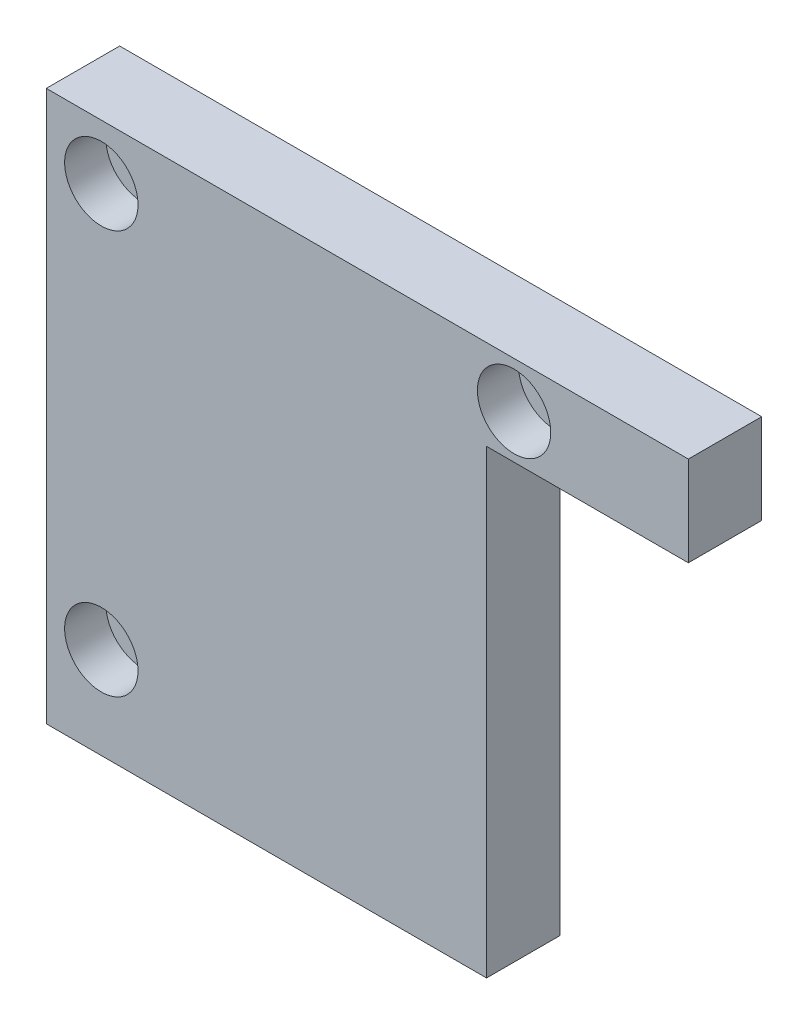
ISO-10303-21;
HEADER;
FILE_DESCRIPTION(('STEP AP214'),'2;1');
FILE_NAME('part.step','',(''),(''),'','','');
FILE_SCHEMA(('AUTOMOTIVE_DESIGN { 1 0 10303 214 1 1 1 1 }'));
ENDSEC;
DATA;
#1=APPLICATION_CONTEXT('core data for automotive mechanical design processes');
#2=APPLICATION_PROTOCOL_DEFINITION('international standard','automotive_design',2000,#1);
#3=PRODUCT_CONTEXT('',#1,'mechanical');
#4=PRODUCT('Part','Part','',(#3));
#5=PRODUCT_RELATED_PRODUCT_CATEGORY('part','',(#4));
#6=PRODUCT_DEFINITION_FORMATION('','',#4);
#7=PRODUCT_DEFINITION_CONTEXT('part definition',#1,'design');
#8=PRODUCT_DEFINITION('design','',#6,#7);
#9=PRODUCT_DEFINITION_SHAPE('','',#8);
#10=(LENGTH_UNIT() NAMED_UNIT(*) SI_UNIT(.MILLI.,.METRE.));
#11=(NAMED_UNIT(*) PLANE_ANGLE_UNIT() SI_UNIT($,.RADIAN.));
#12=(NAMED_UNIT(*) SI_UNIT($,.STERADIAN.) SOLID_ANGLE_UNIT());
#13=UNCERTAINTY_MEASURE_WITH_UNIT(LENGTH_MEASURE(1.E-05),#10,'distance_accuracy_value','');
#14=(GEOMETRIC_REPRESENTATION_CONTEXT(3) GLOBAL_UNCERTAINTY_ASSIGNED_CONTEXT((#13)) GLOBAL_UNIT_ASSIGNED_CONTEXT((#10,
#11,#12)) REPRESENTATION_CONTEXT('',''));
#15=CARTESIAN_POINT('',(0.,0.,0.));
#16=DIRECTION('',(0.,0.,1.));
#17=DIRECTION('',(1.,0.,0.));
#18=AXIS2_PLACEMENT_3D('',#15,#16,#17);
#19=CARTESIAN_POINT('',(70.,0.,4.));
#20=DIRECTION('',(1.,0.,0.));
#21=DIRECTION('',(0.,0.,-1.));
#22=AXIS2_PLACEMENT_3D('',#19,#20,#21);
#23=PLANE('',#22);
#24=DIRECTION('',(0.,-1.,0.));
#25=VECTOR('',#24,1.);
#26=CARTESIAN_POINT('',(70.,0.,-4.));
#27=LINE('',#26,#25);
#28=CARTESIAN_POINT('',(70.,60.,-4.));
#29=VERTEX_POINT('',#28);
#30=CARTESIAN_POINT('',(70.,50.2,-4.));
#31=VERTEX_POINT('',#30);
#32=EDGE_CURVE('E121',#29,#31,#27,.T.);
#33=ORIENTED_EDGE('',*,*,#32,.F.);
#34=DIRECTION('',(0.,0.,-1.));
#35=VECTOR('',#34,1.);
#36=CARTESIAN_POINT('',(70.,60.,4.));
#37=LINE('',#36,#35);
#38=CARTESIAN_POINT('',(70.,60.,4.));
#39=VERTEX_POINT('',#38);
#40=EDGE_CURVE('E11',#39,#29,#37,.T.);
#41=ORIENTED_EDGE('',*,*,#40,.F.);
#42=DIRECTION('',(0.,-1.,0.));
#43=VECTOR('',#42,1.);
#44=CARTESIAN_POINT('',(70.,0.,4.));
#45=LINE('',#44,#43);
#46=CARTESIAN_POINT('',(70.,50.2,4.));
#47=VERTEX_POINT('',#46);
#48=EDGE_CURVE('E135',#39,#47,#45,.T.);
#49=ORIENTED_EDGE('',*,*,#48,.T.);
#50=DIRECTION('',(0.,0.,-1.));
#51=VECTOR('',#50,1.);
#52=CARTESIAN_POINT('',(70.,50.2,4.));
#53=LINE('',#52,#51);
#54=EDGE_CURVE('E86',#47,#31,#53,.T.);
#55=ORIENTED_EDGE('',*,*,#54,.T.);
#56=EDGE_LOOP('',(#33,#41,#49,#55));
#57=FACE_BOUND('',#56,.T.);
#58=ADVANCED_FACE('F41',(#57),#23,.T.);
#59=CARTESIAN_POINT('',(0.,60.,4.));
#60=DIRECTION('',(0.,1.,0.));
#61=DIRECTION('',(0.,0.,1.));
#62=AXIS2_PLACEMENT_3D('',#59,#60,#61);
#63=PLANE('',#62);
#64=DIRECTION('',(1.,0.,0.));
#65=VECTOR('',#64,1.);
#66=CARTESIAN_POINT('',(0.,60.,-4.));
#67=LINE('',#66,#65);
#68=CARTESIAN_POINT('',(0.,60.,-4.));
#69=VERTEX_POINT('',#68);
#70=EDGE_CURVE('E124',#69,#29,#67,.T.);
#71=ORIENTED_EDGE('',*,*,#70,.F.);
#72=DIRECTION('',(0.,0.,-1.));
#73=VECTOR('',#72,1.);
#74=CARTESIAN_POINT('',(0.,60.,4.));
#75=LINE('',#74,#73);
#76=CARTESIAN_POINT('',(0.,60.,4.));
#77=VERTEX_POINT('',#76);
#78=EDGE_CURVE('E49',#77,#69,#75,.T.);
#79=ORIENTED_EDGE('',*,*,#78,.F.);
#80=DIRECTION('',(1.,0.,0.));
#81=VECTOR('',#80,1.);
#82=CARTESIAN_POINT('',(0.,60.,4.));
#83=LINE('',#82,#81);
#84=EDGE_CURVE('E150',#77,#39,#83,.T.);
#85=ORIENTED_EDGE('',*,*,#84,.T.);
#86=ORIENTED_EDGE('',*,*,#40,.T.);
#87=EDGE_LOOP('',(#71,#79,#85,#86));
#88=FACE_BOUND('',#87,.T.);
#89=ADVANCED_FACE('F144',(#88),#63,.T.);
#90=CARTESIAN_POINT('',(0.,0.,4.));
#91=DIRECTION('',(-1.,0.,0.));
#92=DIRECTION('',(0.,-1.,0.));
#93=AXIS2_PLACEMENT_3D('',#90,#91,#92);
#94=PLANE('',#93);
#95=DIRECTION('',(0.,1.,0.));
#96=VECTOR('',#95,1.);
#97=CARTESIAN_POINT('',(0.,0.,-4.));
#98=LINE('',#97,#96);
#99=CARTESIAN_POINT('',(0.,0.,-4.));
#100=VERTEX_POINT('',#99);
#101=EDGE_CURVE('E128',#100,#69,#98,.T.);
#102=ORIENTED_EDGE('',*,*,#101,.F.);
#103=DIRECTION('',(0.,0.,-1.));
#104=VECTOR('',#103,1.);
#105=CARTESIAN_POINT('',(0.,0.,4.));
#106=LINE('',#105,#104);
#107=CARTESIAN_POINT('',(0.,0.,4.));
#108=VERTEX_POINT('',#107);
#109=EDGE_CURVE('E113',#108,#100,#106,.T.);
#110=ORIENTED_EDGE('',*,*,#109,.F.);
#111=DIRECTION('',(0.,1.,0.));
#112=VECTOR('',#111,1.);
#113=CARTESIAN_POINT('',(0.,0.,4.));
#114=LINE('',#113,#112);
#115=EDGE_CURVE('E106',#108,#77,#114,.T.);
#116=ORIENTED_EDGE('',*,*,#115,.T.);
#117=ORIENTED_EDGE('',*,*,#78,.T.);
#118=EDGE_LOOP('',(#102,#110,#116,#117));
#119=FACE_BOUND('',#118,.T.);
#120=ADVANCED_FACE('F141',(#119),#94,.T.);
#121=CARTESIAN_POINT('',(0.,0.,4.));
#122=DIRECTION('',(0.,1.,0.));
#123=DIRECTION('',(0.,0.,1.));
#124=AXIS2_PLACEMENT_3D('',#121,#122,#123);
#125=PLANE('',#124);
#126=DIRECTION('',(1.,0.,0.));
#127=VECTOR('',#126,1.);
#128=CARTESIAN_POINT('',(0.,0.,-4.));
#129=LINE('',#128,#127);
#130=CARTESIAN_POINT('',(48.,0.,-4.));
#131=VERTEX_POINT('',#130);
#132=EDGE_CURVE('E112',#100,#131,#129,.T.);
#133=ORIENTED_EDGE('',*,*,#132,.T.);
#134=DIRECTION('',(0.,0.,-1.));
#135=VECTOR('',#134,1.);
#136=CARTESIAN_POINT('',(48.,0.,4.));
#137=LINE('',#136,#135);
#138=CARTESIAN_POINT('',(48.,0.,4.));
#139=VERTEX_POINT('',#138);
#140=EDGE_CURVE('E109',#139,#131,#137,.T.);
#141=ORIENTED_EDGE('',*,*,#140,.F.);
#142=DIRECTION('',(1.,0.,0.));
#143=VECTOR('',#142,1.);
#144=CARTESIAN_POINT('',(0.,0.,4.));
#145=LINE('',#144,#143);
#146=EDGE_CURVE('E99',#108,#139,#145,.T.);
#147=ORIENTED_EDGE('',*,*,#146,.F.);
#148=ORIENTED_EDGE('',*,*,#109,.T.);
#149=EDGE_LOOP('',(#133,#141,#147,#148));
#150=FACE_BOUND('',#149,.T.);
#151=ADVANCED_FACE('F110',(#150),#125,.F.);
#152=CARTESIAN_POINT('',(48.,0.,4.));
#153=DIRECTION('',(-1.,0.,0.));
#154=DIRECTION('',(0.,0.,1.));
#155=AXIS2_PLACEMENT_3D('',#152,#153,#154);
#156=PLANE('',#155);
#157=DIRECTION('',(0.,1.,0.));
#158=VECTOR('',#157,1.);
#159=CARTESIAN_POINT('',(48.,0.,-4.));
#160=LINE('',#159,#158);
#161=CARTESIAN_POINT('',(48.,50.2,-4.));
#162=VERTEX_POINT('',#161);
#163=EDGE_CURVE('E79',#131,#162,#160,.T.);
#164=ORIENTED_EDGE('',*,*,#163,.T.);
#165=DIRECTION('',(0.,0.,-1.));
#166=VECTOR('',#165,1.);
#167=CARTESIAN_POINT('',(48.,50.2,4.));
#168=LINE('',#167,#166);
#169=CARTESIAN_POINT('',(48.,50.2,4.));
#170=VERTEX_POINT('',#169);
#171=EDGE_CURVE('E114',#170,#162,#168,.T.);
#172=ORIENTED_EDGE('',*,*,#171,.F.);
#173=DIRECTION('',(0.,1.,0.));
#174=VECTOR('',#173,1.);
#175=CARTESIAN_POINT('',(48.,0.,4.));
#176=LINE('',#175,#174);
#177=EDGE_CURVE('E103',#139,#170,#176,.T.);
#178=ORIENTED_EDGE('',*,*,#177,.F.);
#179=ORIENTED_EDGE('',*,*,#140,.T.);
#180=EDGE_LOOP('',(#164,#172,#178,#179));
#181=FACE_BOUND('',#180,.T.);
#182=ADVANCED_FACE('F116',(#181),#156,.F.);
#183=CARTESIAN_POINT('',(0.,50.2,4.));
#184=DIRECTION('',(0.,1.,0.));
#185=DIRECTION('',(0.,0.,1.));
#186=AXIS2_PLACEMENT_3D('',#183,#184,#185);
#187=PLANE('',#186);
#188=DIRECTION('',(1.,0.,0.));
#189=VECTOR('',#188,1.);
#190=CARTESIAN_POINT('',(0.,50.2,-4.));
#191=LINE('',#190,#189);
#192=EDGE_CURVE('E133',#162,#31,#191,.T.);
#193=ORIENTED_EDGE('',*,*,#192,.T.);
#194=ORIENTED_EDGE('',*,*,#54,.F.);
#195=DIRECTION('',(1.,0.,0.));
#196=VECTOR('',#195,1.);
#197=CARTESIAN_POINT('',(0.,50.2,4.));
#198=LINE('',#197,#196);
#199=EDGE_CURVE('E57',#170,#47,#198,.T.);
#200=ORIENTED_EDGE('',*,*,#199,.F.);
#201=ORIENTED_EDGE('',*,*,#171,.T.);
#202=EDGE_LOOP('',(#193,#194,#200,#201));
#203=FACE_BOUND('',#202,.T.);
#204=ADVANCED_FACE('F149',(#203),#187,.F.);
#205=CARTESIAN_POINT('',(0.,0.,4.));
#206=DIRECTION('',(0.,0.,1.));
#207=DIRECTION('',(1.,0.,0.));
#208=AXIS2_PLACEMENT_3D('',#205,#206,#207);
#209=PLANE('',#208);
#210=CARTESIAN_POINT('',(6.,10.,4.));
#211=DIRECTION('',(0.,0.,1.));
#212=DIRECTION('',(1.,0.,0.));
#213=AXIS2_PLACEMENT_3D('',#210,#211,#212);
#214=CIRCLE('',#213,4.);
#215=CARTESIAN_POINT('',(10.,10.,4.));
#216=VERTEX_POINT('',#215);
#217=EDGE_CURVE('E186',#216,#216,#214,.T.);
#218=ORIENTED_EDGE('',*,*,#217,.F.);
#219=EDGE_LOOP('',(#218));
#220=FACE_BOUND('',#219,.T.);
#221=CARTESIAN_POINT('',(6.,54.,4.));
#222=DIRECTION('',(0.,0.,1.));
#223=DIRECTION('',(1.,0.,0.));
#224=AXIS2_PLACEMENT_3D('',#221,#222,#223);
#225=CIRCLE('',#224,4.);
#226=CARTESIAN_POINT('',(10.,54.,4.));
#227=VERTEX_POINT('',#226);
#228=EDGE_CURVE('E174',#227,#227,#225,.T.);
#229=ORIENTED_EDGE('',*,*,#228,.F.);
#230=EDGE_LOOP('',(#229));
#231=FACE_BOUND('',#230,.T.);
#232=CARTESIAN_POINT('',(51.,55.,4.));
#233=DIRECTION('',(0.,0.,1.));
#234=DIRECTION('',(1.,0.,0.));
#235=AXIS2_PLACEMENT_3D('',#232,#233,#234);
#236=CIRCLE('',#235,4.);
#237=CARTESIAN_POINT('',(55.,55.,4.));
#238=VERTEX_POINT('',#237);
#239=EDGE_CURVE('E162',#238,#238,#236,.T.);
#240=ORIENTED_EDGE('',*,*,#239,.F.);
#241=EDGE_LOOP('',(#240));
#242=FACE_BOUND('',#241,.T.);
#243=ORIENTED_EDGE('',*,*,#48,.F.);
#244=ORIENTED_EDGE('',*,*,#84,.F.);
#245=ORIENTED_EDGE('',*,*,#115,.F.);
#246=ORIENTED_EDGE('',*,*,#146,.T.);
#247=ORIENTED_EDGE('',*,*,#177,.T.);
#248=ORIENTED_EDGE('',*,*,#199,.T.);
#249=EDGE_LOOP('',(#243,#244,#245,#246,#247,#248));
#250=FACE_BOUND('',#249,.T.);
#251=ADVANCED_FACE('F101',(#220,#231,#242,#250),#209,.T.);
#252=CARTESIAN_POINT('',(0.,0.,-4.));
#253=DIRECTION('',(0.,0.,1.));
#254=DIRECTION('',(1.,0.,0.));
#255=AXIS2_PLACEMENT_3D('',#252,#253,#254);
#256=PLANE('',#255);
#257=CARTESIAN_POINT('',(6.,10.,-4.));
#258=DIRECTION('',(0.,0.,1.));
#259=DIRECTION('',(1.,0.,0.));
#260=AXIS2_PLACEMENT_3D('',#257,#258,#259);
#261=CIRCLE('',#260,2.);
#262=CARTESIAN_POINT('',(8.,10.,-4.));
#263=VERTEX_POINT('',#262);
#264=EDGE_CURVE('E177',#263,#263,#261,.T.);
#265=ORIENTED_EDGE('',*,*,#264,.T.);
#266=EDGE_LOOP('',(#265));
#267=FACE_BOUND('',#266,.T.);
#268=CARTESIAN_POINT('',(6.,54.,-4.));
#269=DIRECTION('',(0.,0.,1.));
#270=DIRECTION('',(1.,0.,0.));
#271=AXIS2_PLACEMENT_3D('',#268,#269,#270);
#272=CIRCLE('',#271,2.);
#273=CARTESIAN_POINT('',(8.,54.,-4.));
#274=VERTEX_POINT('',#273);
#275=EDGE_CURVE('E165',#274,#274,#272,.T.);
#276=ORIENTED_EDGE('',*,*,#275,.T.);
#277=EDGE_LOOP('',(#276));
#278=FACE_BOUND('',#277,.T.);
#279=CARTESIAN_POINT('',(51.,55.,-4.));
#280=DIRECTION('',(0.,0.,1.));
#281=DIRECTION('',(1.,0.,0.));
#282=AXIS2_PLACEMENT_3D('',#279,#280,#281);
#283=CIRCLE('',#282,1.99999999999999);
#284=CARTESIAN_POINT('',(53.,55.,-4.));
#285=VERTEX_POINT('',#284);
#286=EDGE_CURVE('E125',#285,#285,#283,.T.);
#287=ORIENTED_EDGE('',*,*,#286,.T.);
#288=EDGE_LOOP('',(#287));
#289=FACE_BOUND('',#288,.T.);
#290=ORIENTED_EDGE('',*,*,#32,.T.);
#291=ORIENTED_EDGE('',*,*,#192,.F.);
#292=ORIENTED_EDGE('',*,*,#163,.F.);
#293=ORIENTED_EDGE('',*,*,#132,.F.);
#294=ORIENTED_EDGE('',*,*,#101,.T.);
#295=ORIENTED_EDGE('',*,*,#70,.T.);
#296=EDGE_LOOP('',(#290,#291,#292,#293,#294,#295));
#297=FACE_BOUND('',#296,.T.);
#298=ADVANCED_FACE('F146',(#267,#278,#289,#297),#256,.F.);
#299=CARTESIAN_POINT('',(51.,55.,4.));
#300=DIRECTION('',(0.,0.,1.));
#301=DIRECTION('',(1.,0.,0.));
#302=AXIS2_PLACEMENT_3D('',#299,#300,#301);
#303=CYLINDRICAL_SURFACE('',#302,2.);
#304=ORIENTED_EDGE('',*,*,#286,.F.);
#305=EDGE_LOOP('',(#304));
#306=FACE_BOUND('',#305,.T.);
#307=CARTESIAN_POINT('',(51.,55.,-0.5));
#308=DIRECTION('',(0.,0.,1.));
#309=DIRECTION('',(1.,0.,0.));
#310=AXIS2_PLACEMENT_3D('',#307,#308,#309);
#311=CIRCLE('',#310,2.);
#312=CARTESIAN_POINT('',(53.,55.,-0.5));
#313=VERTEX_POINT('',#312);
#314=EDGE_CURVE('E156',#313,#313,#311,.T.);
#315=ORIENTED_EDGE('',*,*,#314,.T.);
#316=EDGE_LOOP('',(#315));
#317=FACE_BOUND('',#316,.T.);
#318=ADVANCED_FACE('F212',(#306,#317),#303,.F.);
#319=CARTESIAN_POINT('',(53.,55.,-0.5));
#320=DIRECTION('',(0.,0.,-1.));
#321=DIRECTION('',(-1.,0.,0.));
#322=AXIS2_PLACEMENT_3D('',#319,#320,#321);
#323=PLANE('',#322);
#324=ORIENTED_EDGE('',*,*,#314,.F.);
#325=EDGE_LOOP('',(#324));
#326=FACE_BOUND('',#325,.T.);
#327=CARTESIAN_POINT('',(51.,55.,-0.5));
#328=DIRECTION('',(0.,0.,1.));
#329=DIRECTION('',(1.,0.,0.));
#330=AXIS2_PLACEMENT_3D('',#327,#328,#329);
#331=CIRCLE('',#330,4.);
#332=CARTESIAN_POINT('',(55.,55.,-0.5));
#333=VERTEX_POINT('',#332);
#334=EDGE_CURVE('E159',#333,#333,#331,.T.);
#335=ORIENTED_EDGE('',*,*,#334,.T.);
#336=EDGE_LOOP('',(#335));
#337=FACE_BOUND('',#336,.T.);
#338=ADVANCED_FACE('F202',(#326,#337),#323,.F.);
#339=CARTESIAN_POINT('',(51.,55.,4.));
#340=DIRECTION('',(0.,0.,1.));
#341=DIRECTION('',(1.,0.,0.));
#342=AXIS2_PLACEMENT_3D('',#339,#340,#341);
#343=CYLINDRICAL_SURFACE('',#342,4.);
#344=ORIENTED_EDGE('',*,*,#334,.F.);
#345=EDGE_LOOP('',(#344));
#346=FACE_BOUND('',#345,.T.);
#347=ORIENTED_EDGE('',*,*,#239,.T.);
#348=EDGE_LOOP('',(#347));
#349=FACE_BOUND('',#348,.T.);
#350=ADVANCED_FACE('F199',(#346,#349),#343,.F.);
#351=CARTESIAN_POINT('',(6.,54.,4.));
#352=DIRECTION('',(0.,0.,1.));
#353=DIRECTION('',(1.,0.,0.));
#354=AXIS2_PLACEMENT_3D('',#351,#352,#353);
#355=CYLINDRICAL_SURFACE('',#354,2.);
#356=ORIENTED_EDGE('',*,*,#275,.F.);
#357=EDGE_LOOP('',(#356));
#358=FACE_BOUND('',#357,.T.);
#359=CARTESIAN_POINT('',(6.,54.,-0.5));
#360=DIRECTION('',(0.,0.,1.));
#361=DIRECTION('',(1.,0.,0.));
#362=AXIS2_PLACEMENT_3D('',#359,#360,#361);
#363=CIRCLE('',#362,2.);
#364=CARTESIAN_POINT('',(8.,54.,-0.5));
#365=VERTEX_POINT('',#364);
#366=EDGE_CURVE('E168',#365,#365,#363,.T.);
#367=ORIENTED_EDGE('',*,*,#366,.T.);
#368=EDGE_LOOP('',(#367));
#369=FACE_BOUND('',#368,.T.);
#370=ADVANCED_FACE('F201',(#358,#369),#355,.F.);
#371=CARTESIAN_POINT('',(8.,54.,-0.5));
#372=DIRECTION('',(0.,0.,-1.));
#373=DIRECTION('',(-1.,0.,0.));
#374=AXIS2_PLACEMENT_3D('',#371,#372,#373);
#375=PLANE('',#374);
#376=ORIENTED_EDGE('',*,*,#366,.F.);
#377=EDGE_LOOP('',(#376));
#378=FACE_BOUND('',#377,.T.);
#379=CARTESIAN_POINT('',(6.,54.,-0.5));
#380=DIRECTION('',(0.,0.,1.));
#381=DIRECTION('',(1.,0.,0.));
#382=AXIS2_PLACEMENT_3D('',#379,#380,#381);
#383=CIRCLE('',#382,4.);
#384=CARTESIAN_POINT('',(10.,54.,-0.5));
#385=VERTEX_POINT('',#384);
#386=EDGE_CURVE('E171',#385,#385,#383,.T.);
#387=ORIENTED_EDGE('',*,*,#386,.T.);
#388=EDGE_LOOP('',(#387));
#389=FACE_BOUND('',#388,.T.);
#390=ADVANCED_FACE('F209',(#378,#389),#375,.F.);
#391=CARTESIAN_POINT('',(6.,54.,4.));
#392=DIRECTION('',(0.,0.,1.));
#393=DIRECTION('',(1.,0.,0.));
#394=AXIS2_PLACEMENT_3D('',#391,#392,#393);
#395=CYLINDRICAL_SURFACE('',#394,4.);
#396=ORIENTED_EDGE('',*,*,#386,.F.);
#397=EDGE_LOOP('',(#396));
#398=FACE_BOUND('',#397,.T.);
#399=ORIENTED_EDGE('',*,*,#228,.T.);
#400=EDGE_LOOP('',(#399));
#401=FACE_BOUND('',#400,.T.);
#402=ADVANCED_FACE('F262',(#398,#401),#395,.F.);
#403=CARTESIAN_POINT('',(6.,10.,4.));
#404=DIRECTION('',(0.,0.,1.));
#405=DIRECTION('',(1.,0.,0.));
#406=AXIS2_PLACEMENT_3D('',#403,#404,#405);
#407=CYLINDRICAL_SURFACE('',#406,2.);
#408=ORIENTED_EDGE('',*,*,#264,.F.);
#409=EDGE_LOOP('',(#408));
#410=FACE_BOUND('',#409,.T.);
#411=CARTESIAN_POINT('',(6.,10.,-0.5));
#412=DIRECTION('',(0.,0.,1.));
#413=DIRECTION('',(1.,0.,0.));
#414=AXIS2_PLACEMENT_3D('',#411,#412,#413);
#415=CIRCLE('',#414,2.);
#416=CARTESIAN_POINT('',(8.,10.,-0.5));
#417=VERTEX_POINT('',#416);
#418=EDGE_CURVE('E180',#417,#417,#415,.T.);
#419=ORIENTED_EDGE('',*,*,#418,.T.);
#420=EDGE_LOOP('',(#419));
#421=FACE_BOUND('',#420,.T.);
#422=ADVANCED_FACE('F270',(#410,#421),#407,.F.);
#423=CARTESIAN_POINT('',(8.,10.,-0.5));
#424=DIRECTION('',(0.,0.,-1.));
#425=DIRECTION('',(-1.,0.,0.));
#426=AXIS2_PLACEMENT_3D('',#423,#424,#425);
#427=PLANE('',#426);
#428=ORIENTED_EDGE('',*,*,#418,.F.);
#429=EDGE_LOOP('',(#428));
#430=FACE_BOUND('',#429,.T.);
#431=CARTESIAN_POINT('',(6.,10.,-0.5));
#432=DIRECTION('',(0.,0.,1.));
#433=DIRECTION('',(1.,0.,0.));
#434=AXIS2_PLACEMENT_3D('',#431,#432,#433);
#435=CIRCLE('',#434,4.);
#436=CARTESIAN_POINT('',(10.,10.,-0.5));
#437=VERTEX_POINT('',#436);
#438=EDGE_CURVE('E183',#437,#437,#435,.T.);
#439=ORIENTED_EDGE('',*,*,#438,.T.);
#440=EDGE_LOOP('',(#439));
#441=FACE_BOUND('',#440,.T.);
#442=ADVANCED_FACE('F278',(#430,#441),#427,.F.);
#443=CARTESIAN_POINT('',(6.,10.,4.));
#444=DIRECTION('',(0.,0.,1.));
#445=DIRECTION('',(1.,0.,0.));
#446=AXIS2_PLACEMENT_3D('',#443,#444,#445);
#447=CYLINDRICAL_SURFACE('',#446,4.);
#448=ORIENTED_EDGE('',*,*,#438,.F.);
#449=EDGE_LOOP('',(#448));
#450=FACE_BOUND('',#449,.T.);
#451=ORIENTED_EDGE('',*,*,#217,.T.);
#452=EDGE_LOOP('',(#451));
#453=FACE_BOUND('',#452,.T.);
#454=ADVANCED_FACE('F190',(#450,#453),#447,.F.);
#455=CLOSED_SHELL('',(#58,#89,#120,#151,#182,#204,#251,#298,#318,#338,#350,#370,#390,#402,#422,
#442,#454));
#456=MANIFOLD_SOLID_BREP('B2',#455);
#457=ADVANCED_BREP_SHAPE_REPRESENTATION('',(#18,#456),#14);
#458=SHAPE_DEFINITION_REPRESENTATION(#9,#457);
ENDSEC;
END-ISO-10303-21;
